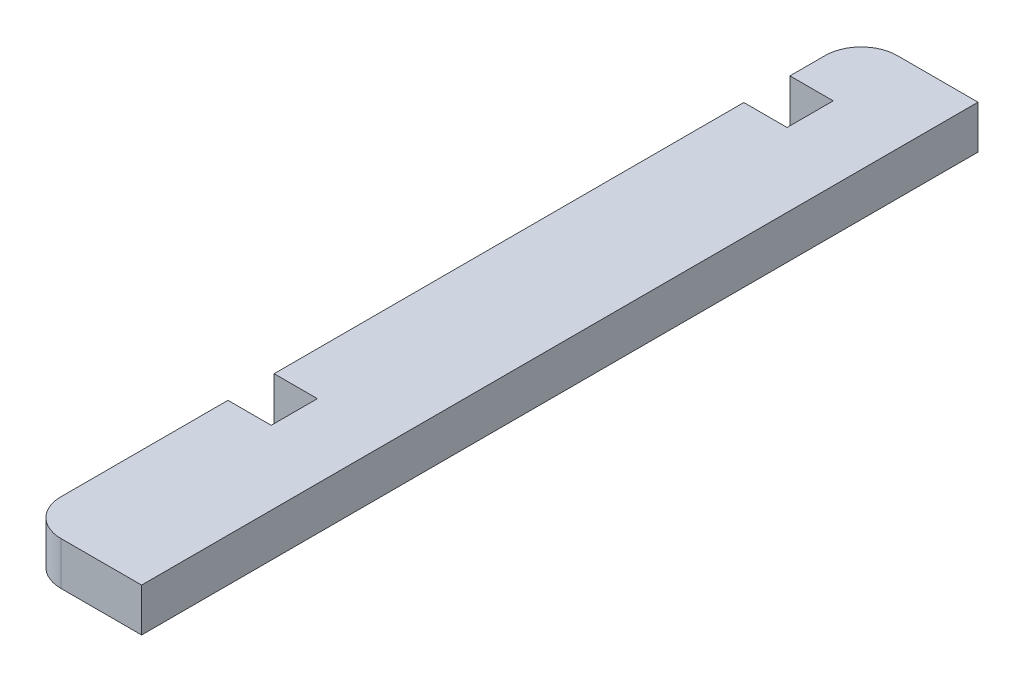
ISO-10303-21;
HEADER;
FILE_DESCRIPTION(('STEP AP214'),'2;1');
FILE_NAME('part.step','',(''),(''),'','','');
FILE_SCHEMA(('AUTOMOTIVE_DESIGN { 1 0 10303 214 1 1 1 1 }'));
ENDSEC;
DATA;
#1=APPLICATION_CONTEXT('core data for automotive mechanical design processes');
#2=APPLICATION_PROTOCOL_DEFINITION('international standard','automotive_design',2000,#1);
#3=PRODUCT_CONTEXT('',#1,'mechanical');
#4=PRODUCT('Part','Part','',(#3));
#5=PRODUCT_RELATED_PRODUCT_CATEGORY('part','',(#4));
#6=PRODUCT_DEFINITION_FORMATION('','',#4);
#7=PRODUCT_DEFINITION_CONTEXT('part definition',#1,'design');
#8=PRODUCT_DEFINITION('design','',#6,#7);
#9=PRODUCT_DEFINITION_SHAPE('','',#8);
#10=(LENGTH_UNIT() NAMED_UNIT(*) SI_UNIT(.MILLI.,.METRE.));
#11=(NAMED_UNIT(*) PLANE_ANGLE_UNIT() SI_UNIT($,.RADIAN.));
#12=(NAMED_UNIT(*) SI_UNIT($,.STERADIAN.) SOLID_ANGLE_UNIT());
#13=UNCERTAINTY_MEASURE_WITH_UNIT(LENGTH_MEASURE(1.E-05),#10,'distance_accuracy_value','');
#14=(GEOMETRIC_REPRESENTATION_CONTEXT(3) GLOBAL_UNCERTAINTY_ASSIGNED_CONTEXT((#13)) GLOBAL_UNIT_ASSIGNED_CONTEXT((#10,
#11,#12)) REPRESENTATION_CONTEXT('',''));
#15=CARTESIAN_POINT('',(0.,0.,0.));
#16=DIRECTION('',(0.,0.,1.));
#17=DIRECTION('',(1.,0.,0.));
#18=AXIS2_PLACEMENT_3D('',#15,#16,#17);
#19=CARTESIAN_POINT('',(-1.4986947856092,72.7163547962719,71.4580851754815));
#20=DIRECTION('',(1.,0.,0.));
#21=DIRECTION('',(0.,0.,-1.));
#22=AXIS2_PLACEMENT_3D('',#19,#20,#21);
#23=PLANE('',#22);
#24=DIRECTION('',(0.,0.,1.));
#25=VECTOR('',#24,1.);
#26=CARTESIAN_POINT('',(-1.4986947856092,69.7163547962719,71.4580851754815));
#27=LINE('',#26,#25);
#28=CARTESIAN_POINT('',(-1.4986947856092,69.7163547962719,71.4580851754815));
#29=VERTEX_POINT('',#28);
#30=CARTESIAN_POINT('',(-1.4986947856092,69.7163547962719,73.8980851754815));
#31=VERTEX_POINT('',#30);
#32=EDGE_CURVE('E135',#29,#31,#27,.T.);
#33=ORIENTED_EDGE('',*,*,#32,.T.);
#34=DIRECTION('',(0.,1.,0.));
#35=VECTOR('',#34,1.);
#36=CARTESIAN_POINT('',(-1.4986947856092,69.7163547962719,73.8980851754815));
#37=LINE('',#36,#35);
#38=CARTESIAN_POINT('',(-1.4986947856092,72.7163547962719,73.8980851754815));
#39=VERTEX_POINT('',#38);
#40=EDGE_CURVE('E165',#31,#39,#37,.T.);
#41=ORIENTED_EDGE('',*,*,#40,.T.);
#42=DIRECTION('',(0.,0.,1.));
#43=VECTOR('',#42,1.);
#44=CARTESIAN_POINT('',(-1.4986947856092,72.7163547962719,71.4580851754815));
#45=LINE('',#44,#43);
#46=CARTESIAN_POINT('',(-1.4986947856092,72.7163547962719,71.4580851754815));
#47=VERTEX_POINT('',#46);
#48=EDGE_CURVE('E112',#47,#39,#45,.T.);
#49=ORIENTED_EDGE('',*,*,#48,.F.);
#50=DIRECTION('',(0.,-1.,0.));
#51=VECTOR('',#50,1.);
#52=CARTESIAN_POINT('',(-1.4986947856092,72.7163547962719,71.4580851754815));
#53=LINE('',#52,#51);
#54=EDGE_CURVE('E117',#47,#29,#53,.T.);
#55=ORIENTED_EDGE('',*,*,#54,.T.);
#56=EDGE_LOOP('',(#33,#41,#49,#55));
#57=FACE_BOUND('',#56,.T.);
#58=ADVANCED_FACE('F32',(#57),#23,.F.);
#59=CARTESIAN_POINT('',(-1.4986947856092,72.716354796272,112.869085175482));
#60=VERTEX_POINT('',#59);
#61=CARTESIAN_POINT('',(-1.4986947856092,72.716354796272,124.458085175482));
#62=VERTEX_POINT('',#61);
#63=EDGE_CURVE('E98',#60,#62,#45,.T.);
#64=ORIENTED_EDGE('',*,*,#63,.F.);
#65=DIRECTION('',(0.,1.,0.));
#66=VECTOR('',#65,1.);
#67=CARTESIAN_POINT('',(-1.4986947856092,69.716354796272,112.869085175482));
#68=LINE('',#67,#66);
#69=CARTESIAN_POINT('',(-1.4986947856092,69.716354796272,112.869085175482));
#70=VERTEX_POINT('',#69);
#71=EDGE_CURVE('E235',#70,#60,#68,.T.);
#72=ORIENTED_EDGE('',*,*,#71,.F.);
#73=CARTESIAN_POINT('',(-1.4986947856092,69.716354796272,124.458085175482));
#74=VERTEX_POINT('',#73);
#75=EDGE_CURVE('E116',#70,#74,#27,.T.);
#76=ORIENTED_EDGE('',*,*,#75,.T.);
#77=DIRECTION('',(0.,-1.,0.));
#78=VECTOR('',#77,1.);
#79=CARTESIAN_POINT('',(-1.4986947856092,72.716354796272,124.458085175482));
#80=LINE('',#79,#78);
#81=EDGE_CURVE('E113',#62,#74,#80,.T.);
#82=ORIENTED_EDGE('',*,*,#81,.F.);
#83=EDGE_LOOP('',(#64,#72,#76,#82));
#84=FACE_BOUND('',#83,.T.);
#85=ADVANCED_FACE('F114',(#84),#23,.F.);
#86=CARTESIAN_POINT('',(6.6013052143908,72.716354796272,126.958085175482));
#87=DIRECTION('',(-1.,0.,0.));
#88=DIRECTION('',(0.,0.,1.));
#89=AXIS2_PLACEMENT_3D('',#86,#87,#88);
#90=PLANE('',#89);
#91=DIRECTION('',(0.,0.,-1.));
#92=VECTOR('',#91,1.);
#93=CARTESIAN_POINT('',(6.6013052143908,69.716354796272,126.958085175482));
#94=LINE('',#93,#92);
#95=CARTESIAN_POINT('',(6.6013052143908,69.716354796272,126.958085175482));
#96=VERTEX_POINT('',#95);
#97=CARTESIAN_POINT('',(6.6013052143908,69.7163547962719,68.9580851754815));
#98=VERTEX_POINT('',#97);
#99=EDGE_CURVE('E127',#96,#98,#94,.T.);
#100=ORIENTED_EDGE('',*,*,#99,.T.);
#101=DIRECTION('',(0.,-1.,0.));
#102=VECTOR('',#101,1.);
#103=CARTESIAN_POINT('',(6.6013052143908,72.7163547962719,68.9580851754815));
#104=LINE('',#103,#102);
#105=CARTESIAN_POINT('',(6.6013052143908,72.7163547962719,68.9580851754815));
#106=VERTEX_POINT('',#105);
#107=EDGE_CURVE('E11',#106,#98,#104,.T.);
#108=ORIENTED_EDGE('',*,*,#107,.F.);
#109=DIRECTION('',(0.,0.,-1.));
#110=VECTOR('',#109,1.);
#111=CARTESIAN_POINT('',(6.6013052143908,72.716354796272,126.958085175482));
#112=LINE('',#111,#110);
#113=CARTESIAN_POINT('',(6.6013052143908,72.716354796272,126.958085175482));
#114=VERTEX_POINT('',#113);
#115=EDGE_CURVE('E141',#114,#106,#112,.T.);
#116=ORIENTED_EDGE('',*,*,#115,.F.);
#117=DIRECTION('',(0.,-1.,0.));
#118=VECTOR('',#117,1.);
#119=CARTESIAN_POINT('',(6.6013052143908,72.716354796272,126.958085175482));
#120=LINE('',#119,#118);
#121=EDGE_CURVE('E122',#114,#96,#120,.T.);
#122=ORIENTED_EDGE('',*,*,#121,.T.);
#123=EDGE_LOOP('',(#100,#108,#116,#122));
#124=FACE_BOUND('',#123,.T.);
#125=ADVANCED_FACE('F34',(#124),#90,.F.);
#126=CARTESIAN_POINT('',(6.6013052143908,72.7163547962719,68.9580851754815));
#127=DIRECTION('',(0.,0.,1.));
#128=DIRECTION('',(0.,-1.,0.));
#129=AXIS2_PLACEMENT_3D('',#126,#127,#128);
#130=PLANE('',#129);
#131=DIRECTION('',(-1.,0.,0.));
#132=VECTOR('',#131,1.);
#133=CARTESIAN_POINT('',(6.6013052143908,69.7163547962719,68.9580851754815));
#134=LINE('',#133,#132);
#135=CARTESIAN_POINT('',(1.0013052143908,69.7163547962719,68.9580851754815));
#136=VERTEX_POINT('',#135);
#137=EDGE_CURVE('E130',#98,#136,#134,.T.);
#138=ORIENTED_EDGE('',*,*,#137,.T.);
#139=DIRECTION('',(0.,-1.,0.));
#140=VECTOR('',#139,1.);
#141=CARTESIAN_POINT('',(1.0013052143908,72.7163547962719,68.9580851754815));
#142=LINE('',#141,#140);
#143=CARTESIAN_POINT('',(1.0013052143908,72.7163547962719,68.9580851754815));
#144=VERTEX_POINT('',#143);
#145=EDGE_CURVE('E41',#144,#136,#142,.T.);
#146=ORIENTED_EDGE('',*,*,#145,.F.);
#147=DIRECTION('',(-1.,0.,0.));
#148=VECTOR('',#147,1.);
#149=CARTESIAN_POINT('',(6.6013052143908,72.7163547962719,68.9580851754815));
#150=LINE('',#149,#148);
#151=EDGE_CURVE('E87',#106,#144,#150,.T.);
#152=ORIENTED_EDGE('',*,*,#151,.F.);
#153=ORIENTED_EDGE('',*,*,#107,.T.);
#154=EDGE_LOOP('',(#138,#146,#152,#153));
#155=FACE_BOUND('',#154,.T.);
#156=ADVANCED_FACE('F262',(#155),#130,.F.);
#157=CARTESIAN_POINT('',(1.0013052143908,72.7163547962719,71.4580851754815));
#158=DIRECTION('',(0.,-1.,0.));
#159=DIRECTION('',(0.,0.,-1.));
#160=AXIS2_PLACEMENT_3D('',#157,#158,#159);
#161=CYLINDRICAL_SURFACE('',#160,2.5);
#162=CARTESIAN_POINT('',(1.0013052143908,69.7163547962719,71.4580851754815));
#163=DIRECTION('',(0.,1.,0.));
#164=DIRECTION('',(0.,0.,1.));
#165=AXIS2_PLACEMENT_3D('',#162,#163,#164);
#166=CIRCLE('',#165,2.5);
#167=EDGE_CURVE('E133',#136,#29,#166,.T.);
#168=ORIENTED_EDGE('',*,*,#167,.T.);
#169=ORIENTED_EDGE('',*,*,#54,.F.);
#170=CARTESIAN_POINT('',(1.0013052143908,72.7163547962719,71.4580851754815));
#171=DIRECTION('',(0.,1.,0.));
#172=DIRECTION('',(0.,0.,1.));
#173=AXIS2_PLACEMENT_3D('',#170,#171,#172);
#174=CIRCLE('',#173,2.5);
#175=EDGE_CURVE('E110',#144,#47,#174,.T.);
#176=ORIENTED_EDGE('',*,*,#175,.F.);
#177=ORIENTED_EDGE('',*,*,#145,.T.);
#178=EDGE_LOOP('',(#168,#169,#176,#177));
#179=FACE_BOUND('',#178,.T.);
#180=ADVANCED_FACE('F149',(#179),#161,.T.);
#181=CARTESIAN_POINT('',(-1.4986947856092,69.7163547962719,77.0980851754815));
#182=VERTEX_POINT('',#181);
#183=CARTESIAN_POINT('',(-1.4986947856092,69.716354796272,109.669085175482));
#184=VERTEX_POINT('',#183);
#185=EDGE_CURVE('E138',#182,#184,#27,.T.);
#186=ORIENTED_EDGE('',*,*,#185,.T.);
#187=DIRECTION('',(0.,1.,0.));
#188=VECTOR('',#187,1.);
#189=CARTESIAN_POINT('',(-1.4986947856092,69.716354796272,109.669085175482));
#190=LINE('',#189,#188);
#191=CARTESIAN_POINT('',(-1.4986947856092,72.716354796272,109.669085175482));
#192=VERTEX_POINT('',#191);
#193=EDGE_CURVE('E231',#184,#192,#190,.T.);
#194=ORIENTED_EDGE('',*,*,#193,.T.);
#195=CARTESIAN_POINT('',(-1.4986947856092,72.7163547962719,77.0980851754815));
#196=VERTEX_POINT('',#195);
#197=EDGE_CURVE('E109',#196,#192,#45,.T.);
#198=ORIENTED_EDGE('',*,*,#197,.F.);
#199=DIRECTION('',(0.,1.,0.));
#200=VECTOR('',#199,1.);
#201=CARTESIAN_POINT('',(-1.4986947856092,69.7163547962719,77.0980851754815));
#202=LINE('',#201,#200);
#203=EDGE_CURVE('E247',#182,#196,#202,.T.);
#204=ORIENTED_EDGE('',*,*,#203,.F.);
#205=EDGE_LOOP('',(#186,#194,#198,#204));
#206=FACE_BOUND('',#205,.T.);
#207=ADVANCED_FACE('F268',(#206),#23,.F.);
#208=CARTESIAN_POINT('',(1.0013052143908,72.716354796272,124.458085175482));
#209=DIRECTION('',(0.,-1.,0.));
#210=DIRECTION('',(0.,0.,-1.));
#211=AXIS2_PLACEMENT_3D('',#208,#209,#210);
#212=CYLINDRICAL_SURFACE('',#211,2.5);
#213=CARTESIAN_POINT('',(1.0013052143908,69.716354796272,124.458085175482));
#214=DIRECTION('',(0.,1.,0.));
#215=DIRECTION('',(0.,0.,1.));
#216=AXIS2_PLACEMENT_3D('',#213,#214,#215);
#217=CIRCLE('',#216,2.5);
#218=CARTESIAN_POINT('',(1.0013052143908,69.716354796272,126.958085175482));
#219=VERTEX_POINT('',#218);
#220=EDGE_CURVE('E73',#74,#219,#217,.T.);
#221=ORIENTED_EDGE('',*,*,#220,.T.);
#222=DIRECTION('',(0.,-1.,0.));
#223=VECTOR('',#222,1.);
#224=CARTESIAN_POINT('',(1.0013052143908,72.716354796272,126.958085175482));
#225=LINE('',#224,#223);
#226=CARTESIAN_POINT('',(1.0013052143908,72.716354796272,126.958085175482));
#227=VERTEX_POINT('',#226);
#228=EDGE_CURVE('E118',#227,#219,#225,.T.);
#229=ORIENTED_EDGE('',*,*,#228,.F.);
#230=CARTESIAN_POINT('',(1.0013052143908,72.716354796272,124.458085175482));
#231=DIRECTION('',(0.,1.,0.));
#232=DIRECTION('',(0.,0.,1.));
#233=AXIS2_PLACEMENT_3D('',#230,#231,#232);
#234=CIRCLE('',#233,2.5);
#235=EDGE_CURVE('E102',#62,#227,#234,.T.);
#236=ORIENTED_EDGE('',*,*,#235,.F.);
#237=ORIENTED_EDGE('',*,*,#81,.T.);
#238=EDGE_LOOP('',(#221,#229,#236,#237));
#239=FACE_BOUND('',#238,.T.);
#240=ADVANCED_FACE('F120',(#239),#212,.T.);
#241=CARTESIAN_POINT('',(1.0013052143908,72.716354796272,126.958085175482));
#242=DIRECTION('',(0.,0.,-1.));
#243=DIRECTION('',(0.,1.,0.));
#244=AXIS2_PLACEMENT_3D('',#241,#242,#243);
#245=PLANE('',#244);
#246=DIRECTION('',(1.,0.,0.));
#247=VECTOR('',#246,1.);
#248=CARTESIAN_POINT('',(1.0013052143908,69.716354796272,126.958085175482));
#249=LINE('',#248,#247);
#250=EDGE_CURVE('E79',#219,#96,#249,.T.);
#251=ORIENTED_EDGE('',*,*,#250,.T.);
#252=ORIENTED_EDGE('',*,*,#121,.F.);
#253=DIRECTION('',(1.,0.,0.));
#254=VECTOR('',#253,1.);
#255=CARTESIAN_POINT('',(1.0013052143908,72.716354796272,126.958085175482));
#256=LINE('',#255,#254);
#257=EDGE_CURVE('E49',#227,#114,#256,.T.);
#258=ORIENTED_EDGE('',*,*,#257,.F.);
#259=ORIENTED_EDGE('',*,*,#228,.T.);
#260=EDGE_LOOP('',(#251,#252,#258,#259));
#261=FACE_BOUND('',#260,.T.);
#262=ADVANCED_FACE('F281',(#261),#245,.F.);
#263=CARTESIAN_POINT('',(1.0013052143908,72.7163547962719,71.4580851754815));
#264=DIRECTION('',(0.,1.,0.));
#265=DIRECTION('',(0.,0.,1.));
#266=AXIS2_PLACEMENT_3D('',#263,#264,#265);
#267=PLANE('',#266);
#268=DIRECTION('',(1.,0.,0.));
#269=VECTOR('',#268,1.);
#270=CARTESIAN_POINT('',(-1.4986947856092,72.716354796272,112.869085175482));
#271=LINE('',#270,#269);
#272=CARTESIAN_POINT('',(1.5013052143908,72.716354796272,112.869085175482));
#273=VERTEX_POINT('',#272);
#274=EDGE_CURVE('E106',#60,#273,#271,.T.);
#275=ORIENTED_EDGE('',*,*,#274,.F.);
#276=ORIENTED_EDGE('',*,*,#63,.T.);
#277=ORIENTED_EDGE('',*,*,#235,.T.);
#278=ORIENTED_EDGE('',*,*,#257,.T.);
#279=ORIENTED_EDGE('',*,*,#115,.T.);
#280=ORIENTED_EDGE('',*,*,#151,.T.);
#281=ORIENTED_EDGE('',*,*,#175,.T.);
#282=ORIENTED_EDGE('',*,*,#48,.T.);
#283=DIRECTION('',(1.,0.,0.));
#284=VECTOR('',#283,1.);
#285=CARTESIAN_POINT('',(1.5013052143908,72.7163547962719,73.8980851754815));
#286=LINE('',#285,#284);
#287=CARTESIAN_POINT('',(1.5013052143908,72.7163547962719,73.8980851754815));
#288=VERTEX_POINT('',#287);
#289=EDGE_CURVE('E177',#288,#39,#286,.F.);
#290=ORIENTED_EDGE('',*,*,#289,.F.);
#291=DIRECTION('',(0.,0.,-1.));
#292=VECTOR('',#291,1.);
#293=CARTESIAN_POINT('',(1.5013052143908,72.7163547962719,76.9980851754815));
#294=LINE('',#293,#292);
#295=CARTESIAN_POINT('',(1.5013052143908,72.7163547962719,77.0980851754815));
#296=VERTEX_POINT('',#295);
#297=EDGE_CURVE('E194',#296,#288,#294,.T.);
#298=ORIENTED_EDGE('',*,*,#297,.F.);
#299=DIRECTION('',(1.,0.,0.));
#300=VECTOR('',#299,1.);
#301=CARTESIAN_POINT('',(-1.4986947856092,72.7163547962719,77.0980851754815));
#302=LINE('',#301,#300);
#303=EDGE_CURVE('E230',#196,#296,#302,.T.);
#304=ORIENTED_EDGE('',*,*,#303,.F.);
#305=ORIENTED_EDGE('',*,*,#197,.T.);
#306=DIRECTION('',(1.,0.,0.));
#307=VECTOR('',#306,1.);
#308=CARTESIAN_POINT('',(1.5013052143908,72.716354796272,109.669085175482));
#309=LINE('',#308,#307);
#310=CARTESIAN_POINT('',(1.5013052143908,72.716354796272,109.669085175482));
#311=VERTEX_POINT('',#310);
#312=EDGE_CURVE('E227',#311,#192,#309,.F.);
#313=ORIENTED_EDGE('',*,*,#312,.F.);
#314=DIRECTION('',(0.,0.,-1.));
#315=VECTOR('',#314,1.);
#316=CARTESIAN_POINT('',(1.5013052143908,72.716354796272,112.769085175482));
#317=LINE('',#316,#315);
#318=EDGE_CURVE('E214',#273,#311,#317,.T.);
#319=ORIENTED_EDGE('',*,*,#318,.F.);
#320=EDGE_LOOP('',(#275,#276,#277,#278,#279,#280,#281,#282,#290,#298,#304,#305,#313,#319));
#321=FACE_BOUND('',#320,.T.);
#322=ADVANCED_FACE('F100',(#321),#267,.T.);
#323=CARTESIAN_POINT('',(1.0013052143908,69.7163547962719,71.4580851754815));
#324=DIRECTION('',(0.,1.,0.));
#325=DIRECTION('',(0.,0.,1.));
#326=AXIS2_PLACEMENT_3D('',#323,#324,#325);
#327=PLANE('',#326);
#328=ORIENTED_EDGE('',*,*,#75,.F.);
#329=DIRECTION('',(1.,0.,0.));
#330=VECTOR('',#329,1.);
#331=CARTESIAN_POINT('',(-1.4986947856092,69.716354796272,112.869085175482));
#332=LINE('',#331,#330);
#333=CARTESIAN_POINT('',(1.5013052143908,69.716354796272,112.869085175482));
#334=VERTEX_POINT('',#333);
#335=EDGE_CURVE('E369',#70,#334,#332,.T.);
#336=ORIENTED_EDGE('',*,*,#335,.T.);
#337=DIRECTION('',(0.,0.,-1.));
#338=VECTOR('',#337,1.);
#339=CARTESIAN_POINT('',(1.5013052143908,69.716354796272,112.769085175482));
#340=LINE('',#339,#338);
#341=CARTESIAN_POINT('',(1.5013052143908,69.716354796272,109.669085175482));
#342=VERTEX_POINT('',#341);
#343=EDGE_CURVE('E131',#334,#342,#340,.T.);
#344=ORIENTED_EDGE('',*,*,#343,.T.);
#345=DIRECTION('',(1.,0.,0.));
#346=VECTOR('',#345,1.);
#347=CARTESIAN_POINT('',(1.5013052143908,69.716354796272,109.669085175482));
#348=LINE('',#347,#346);
#349=EDGE_CURVE('E229',#342,#184,#348,.F.);
#350=ORIENTED_EDGE('',*,*,#349,.T.);
#351=ORIENTED_EDGE('',*,*,#185,.F.);
#352=DIRECTION('',(1.,0.,0.));
#353=VECTOR('',#352,1.);
#354=CARTESIAN_POINT('',(-1.4986947856092,69.7163547962719,77.0980851754815));
#355=LINE('',#354,#353);
#356=CARTESIAN_POINT('',(1.5013052143908,69.7163547962719,77.0980851754815));
#357=VERTEX_POINT('',#356);
#358=EDGE_CURVE('E185',#182,#357,#355,.T.);
#359=ORIENTED_EDGE('',*,*,#358,.T.);
#360=DIRECTION('',(0.,0.,-1.));
#361=VECTOR('',#360,1.);
#362=CARTESIAN_POINT('',(1.5013052143908,69.7163547962719,76.9980851754815));
#363=LINE('',#362,#361);
#364=CARTESIAN_POINT('',(1.5013052143908,69.7163547962719,73.8980851754815));
#365=VERTEX_POINT('',#364);
#366=EDGE_CURVE('E223',#357,#365,#363,.T.);
#367=ORIENTED_EDGE('',*,*,#366,.T.);
#368=DIRECTION('',(1.,0.,0.));
#369=VECTOR('',#368,1.);
#370=CARTESIAN_POINT('',(1.5013052143908,69.7163547962719,73.8980851754815));
#371=LINE('',#370,#369);
#372=EDGE_CURVE('E159',#365,#31,#371,.F.);
#373=ORIENTED_EDGE('',*,*,#372,.T.);
#374=ORIENTED_EDGE('',*,*,#32,.F.);
#375=ORIENTED_EDGE('',*,*,#167,.F.);
#376=ORIENTED_EDGE('',*,*,#137,.F.);
#377=ORIENTED_EDGE('',*,*,#99,.F.);
#378=ORIENTED_EDGE('',*,*,#250,.F.);
#379=ORIENTED_EDGE('',*,*,#220,.F.);
#380=EDGE_LOOP('',(#328,#336,#344,#350,#351,#359,#367,#373,#374,#375,#376,#377,#378,#379));
#381=FACE_BOUND('',#380,.T.);
#382=ADVANCED_FACE('F153',(#381),#327,.F.);
#383=CARTESIAN_POINT('',(1.5013052143908,69.716354796272,112.769085175482));
#384=DIRECTION('',(1.,0.,0.));
#385=DIRECTION('',(0.,1.,0.));
#386=AXIS2_PLACEMENT_3D('',#383,#384,#385);
#387=PLANE('',#386);
#388=ORIENTED_EDGE('',*,*,#318,.T.);
#389=DIRECTION('',(0.,1.,0.));
#390=VECTOR('',#389,1.);
#391=CARTESIAN_POINT('',(1.5013052143908,69.716354796272,109.669085175482));
#392=LINE('',#391,#390);
#393=EDGE_CURVE('E217',#342,#311,#392,.T.);
#394=ORIENTED_EDGE('',*,*,#393,.F.);
#395=ORIENTED_EDGE('',*,*,#343,.F.);
#396=DIRECTION('',(0.,1.,0.));
#397=VECTOR('',#396,1.);
#398=CARTESIAN_POINT('',(1.5013052143908,69.716354796272,112.869085175482));
#399=LINE('',#398,#397);
#400=EDGE_CURVE('E221',#334,#273,#399,.T.);
#401=ORIENTED_EDGE('',*,*,#400,.T.);
#402=EDGE_LOOP('',(#388,#394,#395,#401));
#403=FACE_BOUND('',#402,.T.);
#404=ADVANCED_FACE('F216',(#403),#387,.F.);
#405=CARTESIAN_POINT('',(1.5013052143908,69.7163547962719,76.9980851754815));
#406=DIRECTION('',(1.,0.,0.));
#407=DIRECTION('',(0.,1.,0.));
#408=AXIS2_PLACEMENT_3D('',#405,#406,#407);
#409=PLANE('',#408);
#410=ORIENTED_EDGE('',*,*,#297,.T.);
#411=DIRECTION('',(0.,1.,0.));
#412=VECTOR('',#411,1.);
#413=CARTESIAN_POINT('',(1.5013052143908,69.7163547962719,73.8980851754815));
#414=LINE('',#413,#412);
#415=EDGE_CURVE('E252',#365,#288,#414,.T.);
#416=ORIENTED_EDGE('',*,*,#415,.F.);
#417=ORIENTED_EDGE('',*,*,#366,.F.);
#418=DIRECTION('',(0.,1.,0.));
#419=VECTOR('',#418,1.);
#420=CARTESIAN_POINT('',(1.5013052143908,69.7163547962719,77.0980851754815));
#421=LINE('',#420,#419);
#422=EDGE_CURVE('E244',#357,#296,#421,.T.);
#423=ORIENTED_EDGE('',*,*,#422,.T.);
#424=EDGE_LOOP('',(#410,#416,#417,#423));
#425=FACE_BOUND('',#424,.T.);
#426=ADVANCED_FACE('F286',(#425),#409,.F.);
#427=CARTESIAN_POINT('',(1.5013052143908,69.7163547962719,73.8980851754815));
#428=DIRECTION('',(0.,0.,-1.));
#429=DIRECTION('',(0.,1.,0.));
#430=AXIS2_PLACEMENT_3D('',#427,#428,#429);
#431=PLANE('',#430);
#432=ORIENTED_EDGE('',*,*,#289,.T.);
#433=ORIENTED_EDGE('',*,*,#40,.F.);
#434=ORIENTED_EDGE('',*,*,#372,.F.);
#435=ORIENTED_EDGE('',*,*,#415,.T.);
#436=EDGE_LOOP('',(#432,#433,#434,#435));
#437=FACE_BOUND('',#436,.T.);
#438=ADVANCED_FACE('F287',(#437),#431,.F.);
#439=CARTESIAN_POINT('',(-1.4986947856092,69.7163547962719,77.0980851754815));
#440=DIRECTION('',(0.,0.,1.));
#441=DIRECTION('',(0.,-1.,0.));
#442=AXIS2_PLACEMENT_3D('',#439,#440,#441);
#443=PLANE('',#442);
#444=ORIENTED_EDGE('',*,*,#303,.T.);
#445=ORIENTED_EDGE('',*,*,#422,.F.);
#446=ORIENTED_EDGE('',*,*,#358,.F.);
#447=ORIENTED_EDGE('',*,*,#203,.T.);
#448=EDGE_LOOP('',(#444,#445,#446,#447));
#449=FACE_BOUND('',#448,.T.);
#450=ADVANCED_FACE('F289',(#449),#443,.F.);
#451=CARTESIAN_POINT('',(1.5013052143908,69.716354796272,109.669085175482));
#452=DIRECTION('',(0.,0.,-1.));
#453=DIRECTION('',(0.,1.,0.));
#454=AXIS2_PLACEMENT_3D('',#451,#452,#453);
#455=PLANE('',#454);
#456=ORIENTED_EDGE('',*,*,#312,.T.);
#457=ORIENTED_EDGE('',*,*,#193,.F.);
#458=ORIENTED_EDGE('',*,*,#349,.F.);
#459=ORIENTED_EDGE('',*,*,#393,.T.);
#460=EDGE_LOOP('',(#456,#457,#458,#459));
#461=FACE_BOUND('',#460,.T.);
#462=ADVANCED_FACE('F226',(#461),#455,.F.);
#463=CARTESIAN_POINT('',(-1.4986947856092,69.716354796272,112.869085175482));
#464=DIRECTION('',(0.,0.,1.));
#465=DIRECTION('',(0.,-1.,0.));
#466=AXIS2_PLACEMENT_3D('',#463,#464,#465);
#467=PLANE('',#466);
#468=ORIENTED_EDGE('',*,*,#274,.T.);
#469=ORIENTED_EDGE('',*,*,#400,.F.);
#470=ORIENTED_EDGE('',*,*,#335,.F.);
#471=ORIENTED_EDGE('',*,*,#71,.T.);
#472=EDGE_LOOP('',(#468,#469,#470,#471));
#473=FACE_BOUND('',#472,.T.);
#474=ADVANCED_FACE('F355',(#473),#467,.F.);
#475=CLOSED_SHELL('',(#58,#85,#125,#156,#180,#207,#240,#262,#322,#382,#404,#426,#438,#450,#462,#474));
#476=MANIFOLD_SOLID_BREP('B2',#475);
#477=ADVANCED_BREP_SHAPE_REPRESENTATION('',(#18,#476),#14);
#478=SHAPE_DEFINITION_REPRESENTATION(#9,#477);
ENDSEC;
END-ISO-10303-21;
